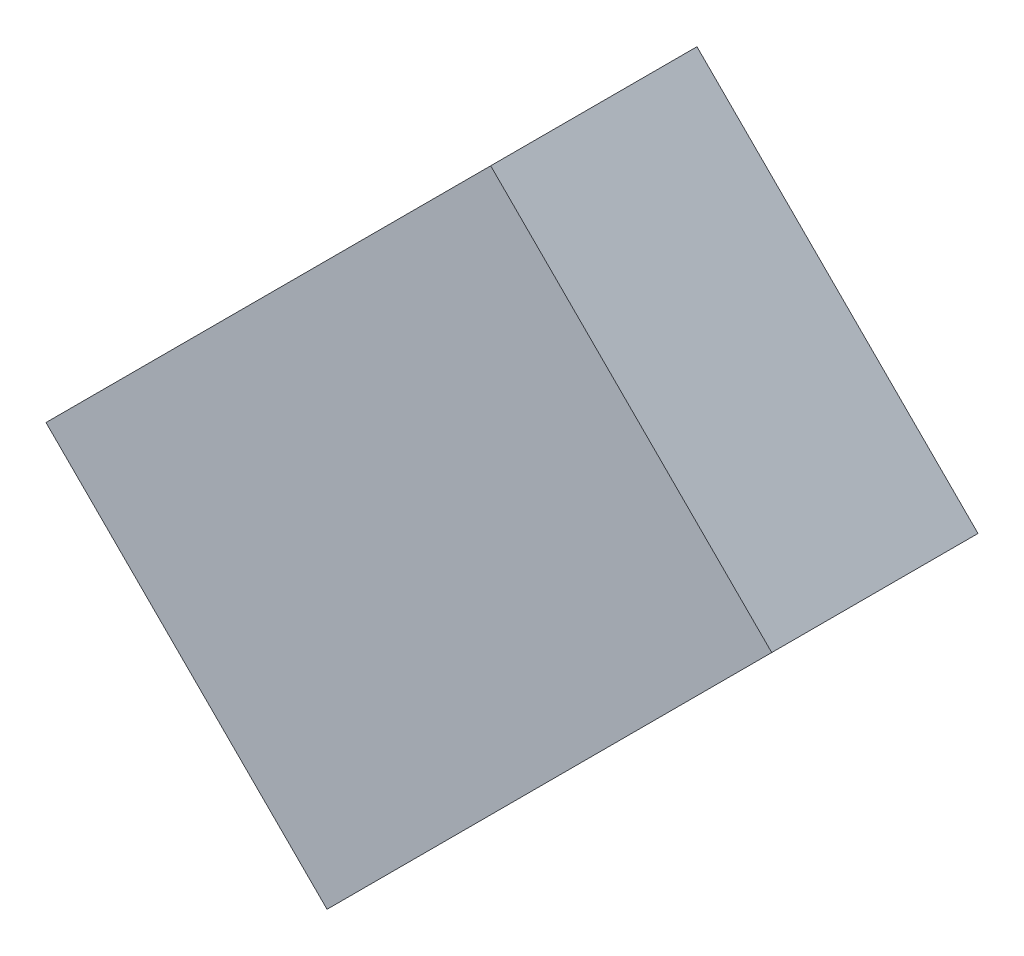
ISO-10303-21;
HEADER;
FILE_DESCRIPTION(('STEP AP214'),'2;1');
FILE_NAME('part.step','',(''),(''),'','','');
FILE_SCHEMA(('AUTOMOTIVE_DESIGN { 1 0 10303 214 1 1 1 1 }'));
ENDSEC;
DATA;
#1=APPLICATION_CONTEXT('core data for automotive mechanical design processes');
#2=APPLICATION_PROTOCOL_DEFINITION('international standard','automotive_design',2000,#1);
#3=PRODUCT_CONTEXT('',#1,'mechanical');
#4=PRODUCT('Part','Part','',(#3));
#5=PRODUCT_RELATED_PRODUCT_CATEGORY('part','',(#4));
#6=PRODUCT_DEFINITION_FORMATION('','',#4);
#7=PRODUCT_DEFINITION_CONTEXT('part definition',#1,'design');
#8=PRODUCT_DEFINITION('design','',#6,#7);
#9=PRODUCT_DEFINITION_SHAPE('','',#8);
#10=(LENGTH_UNIT() NAMED_UNIT(*) SI_UNIT(.MILLI.,.METRE.));
#11=(NAMED_UNIT(*) PLANE_ANGLE_UNIT() SI_UNIT($,.RADIAN.));
#12=(NAMED_UNIT(*) SI_UNIT($,.STERADIAN.) SOLID_ANGLE_UNIT());
#13=UNCERTAINTY_MEASURE_WITH_UNIT(LENGTH_MEASURE(1.E-05),#10,'distance_accuracy_value','');
#14=(GEOMETRIC_REPRESENTATION_CONTEXT(3) GLOBAL_UNCERTAINTY_ASSIGNED_CONTEXT((#13)) GLOBAL_UNIT_ASSIGNED_CONTEXT((#10,
#11,#12)) REPRESENTATION_CONTEXT('',''));
#15=CARTESIAN_POINT('',(0.,0.,0.));
#16=DIRECTION('',(0.,0.,1.));
#17=DIRECTION('',(1.,0.,0.));
#18=AXIS2_PLACEMENT_3D('',#15,#16,#17);
#19=CARTESIAN_POINT('',(-43.01385642862,-47.38614357137,116.6));
#20=DIRECTION('',(0.,0.,1.));
#21=DIRECTION('',(1.,0.,0.));
#22=AXIS2_PLACEMENT_3D('',#19,#20,#21);
#23=PLANE('',#22);
#24=DIRECTION('',(-0.707106781186548,0.707106781186548,0.));
#25=VECTOR('',#24,1.);
#26=CARTESIAN_POINT('',(-43.01385642862,-47.38614357137,116.6));
#27=LINE('',#26,#25);
#28=CARTESIAN_POINT('',(-43.01385642862,-47.38614357137,116.6));
#29=VERTEX_POINT('',#28);
#30=CARTESIAN_POINT('',(-54.18614357137,-36.21385642862,116.6));
#31=VERTEX_POINT('',#30);
#32=EDGE_CURVE('E88',#29,#31,#27,.T.);
#33=ORIENTED_EDGE('',*,*,#32,.F.);
#34=DIRECTION('',(0.707106781186548,0.707106781186548,0.));
#35=VECTOR('',#34,1.);
#36=CARTESIAN_POINT('',(-43.01385642862,-47.38614357137,116.6));
#37=LINE('',#36,#35);
#38=CARTESIAN_POINT('',(-25.33618689896,-29.70847404171,116.6));
#39=VERTEX_POINT('',#38);
#40=EDGE_CURVE('E75',#29,#39,#37,.T.);
#41=ORIENTED_EDGE('',*,*,#40,.T.);
#42=DIRECTION('',(-0.707106781186548,0.707106781186548,0.));
#43=VECTOR('',#42,1.);
#44=CARTESIAN_POINT('',(-25.33618689896,-29.70847404171,116.6));
#45=LINE('',#44,#43);
#46=CARTESIAN_POINT('',(-36.50847404171,-18.53618689896,116.6));
#47=VERTEX_POINT('',#46);
#48=EDGE_CURVE('E83',#39,#47,#45,.T.);
#49=ORIENTED_EDGE('',*,*,#48,.T.);
#50=DIRECTION('',(0.707106781186548,0.707106781186548,0.));
#51=VECTOR('',#50,1.);
#52=CARTESIAN_POINT('',(-54.18614357137,-36.21385642862,116.6));
#53=LINE('',#52,#51);
#54=EDGE_CURVE('E10',#31,#47,#53,.T.);
#55=ORIENTED_EDGE('',*,*,#54,.F.);
#56=EDGE_LOOP('',(#33,#41,#49,#55));
#57=FACE_BOUND('',#56,.T.);
#58=ADVANCED_FACE('F15',(#57),#23,.T.);
#59=CARTESIAN_POINT('',(-43.01385642862,-47.38614357137,108.4));
#60=DIRECTION('',(0.,0.,1.));
#61=DIRECTION('',(1.,0.,0.));
#62=AXIS2_PLACEMENT_3D('',#59,#60,#61);
#63=PLANE('',#62);
#64=DIRECTION('',(0.707106781186548,0.707106781186548,0.));
#65=VECTOR('',#64,1.);
#66=CARTESIAN_POINT('',(-54.18614357137,-36.21385642862,108.4));
#67=LINE('',#66,#65);
#68=CARTESIAN_POINT('',(-54.18614357137,-36.21385642862,108.4));
#69=VERTEX_POINT('',#68);
#70=CARTESIAN_POINT('',(-36.50847404171,-18.53618689896,108.4));
#71=VERTEX_POINT('',#70);
#72=EDGE_CURVE('E26',#69,#71,#67,.T.);
#73=ORIENTED_EDGE('',*,*,#72,.T.);
#74=DIRECTION('',(-0.707106781186548,0.707106781186548,0.));
#75=VECTOR('',#74,1.);
#76=CARTESIAN_POINT('',(-25.33618689896,-29.70847404171,108.4));
#77=LINE('',#76,#75);
#78=CARTESIAN_POINT('',(-25.33618689896,-29.70847404171,108.4));
#79=VERTEX_POINT('',#78);
#80=EDGE_CURVE('E104',#79,#71,#77,.T.);
#81=ORIENTED_EDGE('',*,*,#80,.F.);
#82=DIRECTION('',(0.707106781186548,0.707106781186548,0.));
#83=VECTOR('',#82,1.);
#84=CARTESIAN_POINT('',(-43.01385642862,-47.38614357137,108.4));
#85=LINE('',#84,#83);
#86=CARTESIAN_POINT('',(-43.01385642862,-47.38614357137,108.4));
#87=VERTEX_POINT('',#86);
#88=EDGE_CURVE('E55',#87,#79,#85,.T.);
#89=ORIENTED_EDGE('',*,*,#88,.F.);
#90=DIRECTION('',(-0.707106781186548,0.707106781186548,0.));
#91=VECTOR('',#90,1.);
#92=CARTESIAN_POINT('',(-43.01385642862,-47.38614357137,108.4));
#93=LINE('',#92,#91);
#94=EDGE_CURVE('E89',#87,#69,#93,.T.);
#95=ORIENTED_EDGE('',*,*,#94,.T.);
#96=EDGE_LOOP('',(#73,#81,#89,#95));
#97=FACE_BOUND('',#96,.T.);
#98=ADVANCED_FACE('F120',(#97),#63,.F.);
#99=CARTESIAN_POINT('',(-54.18614357137,-36.21385642862,108.4));
#100=DIRECTION('',(-0.707106781186548,0.707106781186548,0.));
#101=DIRECTION('',(0.,0.,1.));
#102=AXIS2_PLACEMENT_3D('',#99,#100,#101);
#103=PLANE('',#102);
#104=ORIENTED_EDGE('',*,*,#72,.F.);
#105=DIRECTION('',(0.,0.,1.));
#106=VECTOR('',#105,1.);
#107=CARTESIAN_POINT('',(-54.18614357137,-36.21385642862,108.4));
#108=LINE('',#107,#106);
#109=EDGE_CURVE('E93',#69,#31,#108,.T.);
#110=ORIENTED_EDGE('',*,*,#109,.T.);
#111=ORIENTED_EDGE('',*,*,#54,.T.);
#112=DIRECTION('',(0.,0.,1.));
#113=VECTOR('',#112,1.);
#114=CARTESIAN_POINT('',(-36.50847404171,-18.53618689896,108.4));
#115=LINE('',#114,#113);
#116=EDGE_CURVE('E101',#71,#47,#115,.T.);
#117=ORIENTED_EDGE('',*,*,#116,.F.);
#118=EDGE_LOOP('',(#104,#110,#111,#117));
#119=FACE_BOUND('',#118,.T.);
#120=ADVANCED_FACE('F126',(#119),#103,.T.);
#121=CARTESIAN_POINT('',(-43.01385642862,-47.38614357137,108.4));
#122=DIRECTION('',(-0.707106781186548,0.707106781186548,0.));
#123=DIRECTION('',(0.,0.,1.));
#124=AXIS2_PLACEMENT_3D('',#121,#122,#123);
#125=PLANE('',#124);
#126=DIRECTION('',(0.,0.,1.));
#127=VECTOR('',#126,1.);
#128=CARTESIAN_POINT('',(-25.33618689896,-29.70847404171,108.4));
#129=LINE('',#128,#127);
#130=EDGE_CURVE('E19',#79,#39,#129,.T.);
#131=ORIENTED_EDGE('',*,*,#130,.T.);
#132=ORIENTED_EDGE('',*,*,#40,.F.);
#133=DIRECTION('',(0.,0.,1.));
#134=VECTOR('',#133,1.);
#135=CARTESIAN_POINT('',(-43.01385642862,-47.38614357137,108.4));
#136=LINE('',#135,#134);
#137=EDGE_CURVE('E78',#87,#29,#136,.T.);
#138=ORIENTED_EDGE('',*,*,#137,.F.);
#139=ORIENTED_EDGE('',*,*,#88,.T.);
#140=EDGE_LOOP('',(#131,#132,#138,#139));
#141=FACE_BOUND('',#140,.T.);
#142=ADVANCED_FACE('F77',(#141),#125,.F.);
#143=CARTESIAN_POINT('',(-25.33618689896,-29.70847404171,108.4));
#144=DIRECTION('',(0.707106781186548,0.707106781186548,0.));
#145=DIRECTION('',(0.,0.,-1.));
#146=AXIS2_PLACEMENT_3D('',#143,#144,#145);
#147=PLANE('',#146);
#148=ORIENTED_EDGE('',*,*,#130,.F.);
#149=ORIENTED_EDGE('',*,*,#80,.T.);
#150=ORIENTED_EDGE('',*,*,#116,.T.);
#151=ORIENTED_EDGE('',*,*,#48,.F.);
#152=EDGE_LOOP('',(#148,#149,#150,#151));
#153=FACE_BOUND('',#152,.T.);
#154=ADVANCED_FACE('F136',(#153),#147,.T.);
#155=CARTESIAN_POINT('',(-43.01385642862,-47.38614357137,108.4));
#156=DIRECTION('',(0.707106781186548,0.707106781186548,0.));
#157=DIRECTION('',(0.,0.,-1.));
#158=AXIS2_PLACEMENT_3D('',#155,#156,#157);
#159=PLANE('',#158);
#160=ORIENTED_EDGE('',*,*,#32,.T.);
#161=ORIENTED_EDGE('',*,*,#109,.F.);
#162=ORIENTED_EDGE('',*,*,#94,.F.);
#163=ORIENTED_EDGE('',*,*,#137,.T.);
#164=EDGE_LOOP('',(#160,#161,#162,#163));
#165=FACE_BOUND('',#164,.T.);
#166=ADVANCED_FACE('F17',(#165),#159,.F.);
#167=CLOSED_SHELL('',(#58,#98,#120,#142,#154,#166));
#168=MANIFOLD_SOLID_BREP('B1',#167);
#169=ADVANCED_BREP_SHAPE_REPRESENTATION('',(#18,#168),#14);
#170=SHAPE_DEFINITION_REPRESENTATION(#9,#169);
ENDSEC;
END-ISO-10303-21;
